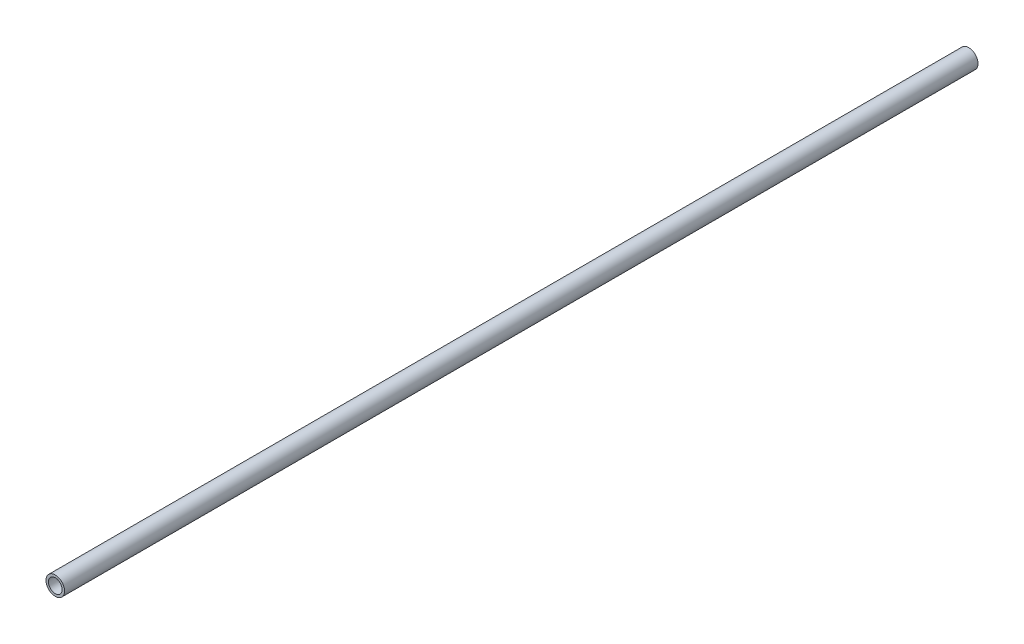
ISO-10303-21;
HEADER;
FILE_DESCRIPTION(('STEP AP214'),'2;1');
FILE_NAME('part.step','',(''),(''),'','','');
FILE_SCHEMA(('AUTOMOTIVE_DESIGN { 1 0 10303 214 1 1 1 1 }'));
ENDSEC;
DATA;
#1=APPLICATION_CONTEXT('core data for automotive mechanical design processes');
#2=APPLICATION_PROTOCOL_DEFINITION('international standard','automotive_design',2000,#1);
#3=PRODUCT_CONTEXT('',#1,'mechanical');
#4=PRODUCT('Part','Part','',(#3));
#5=PRODUCT_RELATED_PRODUCT_CATEGORY('part','',(#4));
#6=PRODUCT_DEFINITION_FORMATION('','',#4);
#7=PRODUCT_DEFINITION_CONTEXT('part definition',#1,'design');
#8=PRODUCT_DEFINITION('design','',#6,#7);
#9=PRODUCT_DEFINITION_SHAPE('','',#8);
#10=(LENGTH_UNIT() NAMED_UNIT(*) SI_UNIT(.MILLI.,.METRE.));
#11=(NAMED_UNIT(*) PLANE_ANGLE_UNIT() SI_UNIT($,.RADIAN.));
#12=(NAMED_UNIT(*) SI_UNIT($,.STERADIAN.) SOLID_ANGLE_UNIT());
#13=UNCERTAINTY_MEASURE_WITH_UNIT(LENGTH_MEASURE(1.E-05),#10,'distance_accuracy_value','');
#14=(GEOMETRIC_REPRESENTATION_CONTEXT(3) GLOBAL_UNCERTAINTY_ASSIGNED_CONTEXT((#13)) GLOBAL_UNIT_ASSIGNED_CONTEXT((#10,
#11,#12)) REPRESENTATION_CONTEXT('',''));
#15=CARTESIAN_POINT('',(0.,0.,0.));
#16=DIRECTION('',(0.,0.,1.));
#17=DIRECTION('',(1.,0.,0.));
#18=AXIS2_PLACEMENT_3D('',#15,#16,#17);
#19=CARTESIAN_POINT('',(0.,0.,525.));
#20=DIRECTION('',(0.,0.,1.));
#21=DIRECTION('',(1.,0.,0.));
#22=AXIS2_PLACEMENT_3D('',#19,#20,#21);
#23=PLANE('',#22);
#24=CARTESIAN_POINT('',(0.,0.,525.));
#25=DIRECTION('',(0.,0.,1.));
#26=DIRECTION('',(1.,0.,0.));
#27=AXIS2_PLACEMENT_3D('',#24,#25,#26);
#28=CIRCLE('',#27,10.668);
#29=CARTESIAN_POINT('',(10.668,0.,525.));
#30=VERTEX_POINT('',#29);
#31=EDGE_CURVE('E11',#30,#30,#28,.T.);
#32=ORIENTED_EDGE('',*,*,#31,.T.);
#33=EDGE_LOOP('',(#32));
#34=FACE_BOUND('',#33,.T.);
#35=CARTESIAN_POINT('',(0.,0.,525.));
#36=DIRECTION('',(0.,0.,1.));
#37=DIRECTION('',(1.,0.,0.));
#38=AXIS2_PLACEMENT_3D('',#35,#36,#37);
#39=CIRCLE('',#38,7.8994);
#40=CARTESIAN_POINT('',(7.8994,0.,525.));
#41=VERTEX_POINT('',#40);
#42=EDGE_CURVE('E48',#41,#41,#39,.T.);
#43=ORIENTED_EDGE('',*,*,#42,.F.);
#44=EDGE_LOOP('',(#43));
#45=FACE_BOUND('',#44,.T.);
#46=ADVANCED_FACE('F37',(#34,#45),#23,.T.);
#47=CARTESIAN_POINT('',(0.,0.,-525.));
#48=DIRECTION('',(0.,0.,1.));
#49=DIRECTION('',(1.,0.,0.));
#50=AXIS2_PLACEMENT_3D('',#47,#48,#49);
#51=PLANE('',#50);
#52=CARTESIAN_POINT('',(0.,0.,-525.));
#53=DIRECTION('',(0.,0.,1.));
#54=DIRECTION('',(1.,0.,0.));
#55=AXIS2_PLACEMENT_3D('',#52,#53,#54);
#56=CIRCLE('',#55,10.668);
#57=CARTESIAN_POINT('',(10.668,0.,-525.));
#58=VERTEX_POINT('',#57);
#59=EDGE_CURVE('E41',#58,#58,#56,.T.);
#60=ORIENTED_EDGE('',*,*,#59,.F.);
#61=EDGE_LOOP('',(#60));
#62=FACE_BOUND('',#61,.T.);
#63=CARTESIAN_POINT('',(0.,0.,-525.));
#64=DIRECTION('',(0.,0.,1.));
#65=DIRECTION('',(1.,0.,0.));
#66=AXIS2_PLACEMENT_3D('',#63,#64,#65);
#67=CIRCLE('',#66,7.8994);
#68=CARTESIAN_POINT('',(7.8994,0.,-525.));
#69=VERTEX_POINT('',#68);
#70=EDGE_CURVE('E50',#69,#69,#67,.T.);
#71=ORIENTED_EDGE('',*,*,#70,.T.);
#72=EDGE_LOOP('',(#71));
#73=FACE_BOUND('',#72,.T.);
#74=ADVANCED_FACE('F60',(#62,#73),#51,.F.);
#75=CARTESIAN_POINT('',(0.,0.,525.));
#76=DIRECTION('',(0.,0.,-1.));
#77=DIRECTION('',(-1.,0.,0.));
#78=AXIS2_PLACEMENT_3D('',#75,#76,#77);
#79=CYLINDRICAL_SURFACE('',#78,10.668);
#80=ORIENTED_EDGE('',*,*,#31,.F.);
#81=EDGE_LOOP('',(#80));
#82=FACE_BOUND('',#81,.T.);
#83=ORIENTED_EDGE('',*,*,#59,.T.);
#84=EDGE_LOOP('',(#83));
#85=FACE_BOUND('',#84,.T.);
#86=ADVANCED_FACE('F39',(#82,#85),#79,.T.);
#87=CARTESIAN_POINT('',(0.,0.,525.));
#88=DIRECTION('',(0.,0.,-1.));
#89=DIRECTION('',(-1.,0.,0.));
#90=AXIS2_PLACEMENT_3D('',#87,#88,#89);
#91=CYLINDRICAL_SURFACE('',#90,7.8994);
#92=ORIENTED_EDGE('',*,*,#42,.T.);
#93=EDGE_LOOP('',(#92));
#94=FACE_BOUND('',#93,.T.);
#95=ORIENTED_EDGE('',*,*,#70,.F.);
#96=EDGE_LOOP('',(#95));
#97=FACE_BOUND('',#96,.T.);
#98=ADVANCED_FACE('F56',(#94,#97),#91,.F.);
#99=CLOSED_SHELL('',(#46,#74,#86,#98));
#100=MANIFOLD_SOLID_BREP('B2',#99);
#101=ADVANCED_BREP_SHAPE_REPRESENTATION('',(#18,#100),#14);
#102=SHAPE_DEFINITION_REPRESENTATION(#9,#101);
ENDSEC;
END-ISO-10303-21;
